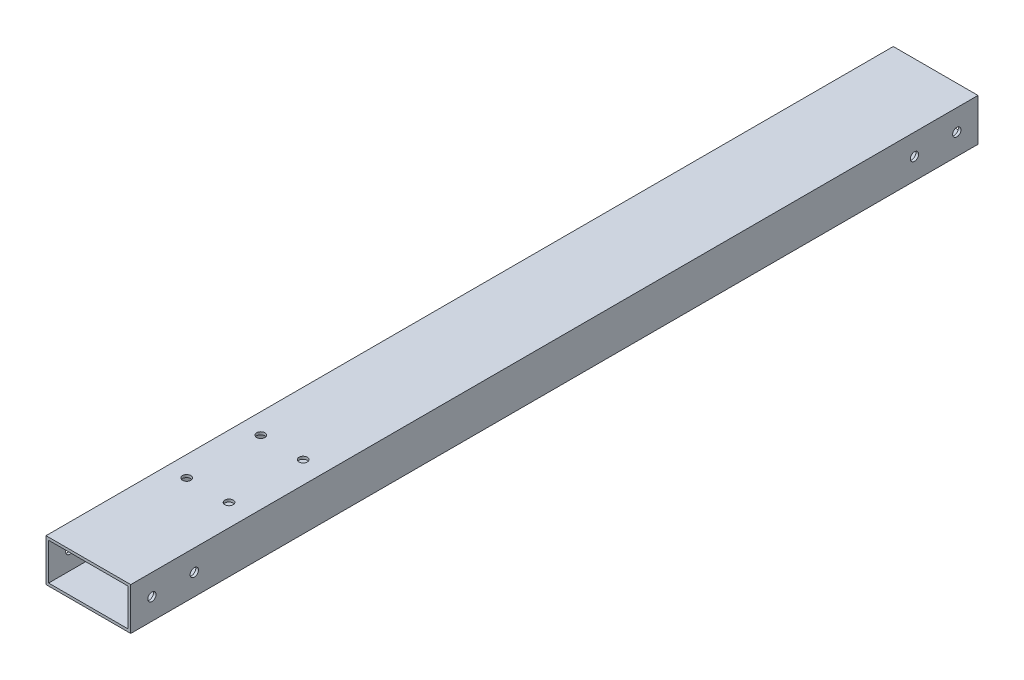
ISO-10303-21;
HEADER;
FILE_DESCRIPTION(('STEP AP214'),'2;1');
FILE_NAME('part.step','',(''),(''),'','','');
FILE_SCHEMA(('AUTOMOTIVE_DESIGN { 1 0 10303 214 1 1 1 1 }'));
ENDSEC;
DATA;
#1=APPLICATION_CONTEXT('core data for automotive mechanical design processes');
#2=APPLICATION_PROTOCOL_DEFINITION('international standard','automotive_design',2000,#1);
#3=PRODUCT_CONTEXT('',#1,'mechanical');
#4=PRODUCT('Part','Part','',(#3));
#5=PRODUCT_RELATED_PRODUCT_CATEGORY('part','',(#4));
#6=PRODUCT_DEFINITION_FORMATION('','',#4);
#7=PRODUCT_DEFINITION_CONTEXT('part definition',#1,'design');
#8=PRODUCT_DEFINITION('design','',#6,#7);
#9=PRODUCT_DEFINITION_SHAPE('','',#8);
#10=(LENGTH_UNIT() NAMED_UNIT(*) SI_UNIT(.MILLI.,.METRE.));
#11=(NAMED_UNIT(*) PLANE_ANGLE_UNIT() SI_UNIT($,.RADIAN.));
#12=(NAMED_UNIT(*) SI_UNIT($,.STERADIAN.) SOLID_ANGLE_UNIT());
#13=UNCERTAINTY_MEASURE_WITH_UNIT(LENGTH_MEASURE(1.E-05),#10,'distance_accuracy_value','');
#14=(GEOMETRIC_REPRESENTATION_CONTEXT(3) GLOBAL_UNCERTAINTY_ASSIGNED_CONTEXT((#13)) GLOBAL_UNIT_ASSIGNED_CONTEXT((#10,
#11,#12)) REPRESENTATION_CONTEXT('',''));
#15=CARTESIAN_POINT('',(0.,0.,0.));
#16=DIRECTION('',(0.,0.,1.));
#17=DIRECTION('',(1.,0.,0.));
#18=AXIS2_PLACEMENT_3D('',#15,#16,#17);
#19=CARTESIAN_POINT('',(25.4,12.7,254.000000508));
#20=DIRECTION('',(0.,-1.,0.));
#21=DIRECTION('',(1.,0.,0.));
#22=AXIS2_PLACEMENT_3D('',#19,#20,#21);
#23=PLANE('',#22);
#24=CARTESIAN_POINT('',(-13.2079999099055,12.7,137.396900507907));
#25=DIRECTION('',(0.,1.,0.));
#26=DIRECTION('',(0.,0.,1.));
#27=AXIS2_PLACEMENT_3D('',#24,#25,#26);
#28=CIRCLE('',#27,2.48919999999999);
#29=CARTESIAN_POINT('',(-13.2079999099055,12.7,139.886100507907));
#30=VERTEX_POINT('',#29);
#31=EDGE_CURVE('E250',#30,#30,#28,.T.);
#32=ORIENTED_EDGE('',*,*,#31,.F.);
#33=EDGE_LOOP('',(#32));
#34=FACE_BOUND('',#33,.T.);
#35=CARTESIAN_POINT('',(-13.2079999099055,12.7,181.846900507907));
#36=DIRECTION('',(0.,1.,0.));
#37=DIRECTION('',(0.,0.,1.));
#38=AXIS2_PLACEMENT_3D('',#35,#36,#37);
#39=CIRCLE('',#38,2.48919999999999);
#40=CARTESIAN_POINT('',(-13.2079999099055,12.7,184.336100507907));
#41=VERTEX_POINT('',#40);
#42=EDGE_CURVE('E247',#41,#41,#39,.T.);
#43=ORIENTED_EDGE('',*,*,#42,.F.);
#44=EDGE_LOOP('',(#43));
#45=FACE_BOUND('',#44,.T.);
#46=CARTESIAN_POINT('',(12.1920000900945,12.7,181.846900507907));
#47=DIRECTION('',(0.,1.,0.));
#48=DIRECTION('',(0.,0.,1.));
#49=AXIS2_PLACEMENT_3D('',#46,#47,#48);
#50=CIRCLE('',#49,2.48919999999999);
#51=CARTESIAN_POINT('',(12.1920000900945,12.7,184.336100507907));
#52=VERTEX_POINT('',#51);
#53=EDGE_CURVE('E269',#52,#52,#50,.T.);
#54=ORIENTED_EDGE('',*,*,#53,.F.);
#55=EDGE_LOOP('',(#54));
#56=FACE_BOUND('',#55,.T.);
#57=DIRECTION('',(0.,0.,-1.));
#58=VECTOR('',#57,1.);
#59=CARTESIAN_POINT('',(25.4,12.7,254.000000508));
#60=LINE('',#59,#58);
#61=CARTESIAN_POINT('',(25.4,12.7,254.000000508));
#62=VERTEX_POINT('',#61);
#63=CARTESIAN_POINT('',(25.4,12.7,-254.000000508));
#64=VERTEX_POINT('',#63);
#65=EDGE_CURVE('E199',#62,#64,#60,.T.);
#66=ORIENTED_EDGE('',*,*,#65,.T.);
#67=DIRECTION('',(-1.,0.,0.));
#68=VECTOR('',#67,1.);
#69=CARTESIAN_POINT('',(25.4,12.7,-254.000000508));
#70=LINE('',#69,#68);
#71=CARTESIAN_POINT('',(-25.4,12.7,-254.000000508));
#72=VERTEX_POINT('',#71);
#73=EDGE_CURVE('E164',#64,#72,#70,.T.);
#74=ORIENTED_EDGE('',*,*,#73,.T.);
#75=DIRECTION('',(0.,0.,-1.));
#76=VECTOR('',#75,1.);
#77=CARTESIAN_POINT('',(-25.4,12.7,254.000000508));
#78=LINE('',#77,#76);
#79=CARTESIAN_POINT('',(-25.4,12.7,254.000000508));
#80=VERTEX_POINT('',#79);
#81=EDGE_CURVE('E196',#80,#72,#78,.T.);
#82=ORIENTED_EDGE('',*,*,#81,.F.);
#83=DIRECTION('',(-1.,0.,0.));
#84=VECTOR('',#83,1.);
#85=CARTESIAN_POINT('',(25.4,12.7,254.000000508));
#86=LINE('',#85,#84);
#87=EDGE_CURVE('E69',#62,#80,#86,.T.);
#88=ORIENTED_EDGE('',*,*,#87,.F.);
#89=EDGE_LOOP('',(#66,#74,#82,#88));
#90=FACE_BOUND('',#89,.T.);
#91=CARTESIAN_POINT('',(12.1920000900945,12.7,137.396900507907));
#92=DIRECTION('',(0.,1.,0.));
#93=DIRECTION('',(0.,0.,1.));
#94=AXIS2_PLACEMENT_3D('',#91,#92,#93);
#95=CIRCLE('',#94,2.48919999999999);
#96=CARTESIAN_POINT('',(12.1920000900945,12.7,139.886100507907));
#97=VERTEX_POINT('',#96);
#98=EDGE_CURVE('E672',#97,#97,#95,.T.);
#99=ORIENTED_EDGE('',*,*,#98,.F.);
#100=EDGE_LOOP('',(#99));
#101=FACE_BOUND('',#100,.T.);
#102=ADVANCED_FACE('F43',(#34,#45,#56,#90,#101),#23,.F.);
#103=CARTESIAN_POINT('',(25.4,-12.7,254.000000508));
#104=DIRECTION('',(-1.,0.,0.));
#105=DIRECTION('',(0.,0.,1.));
#106=AXIS2_PLACEMENT_3D('',#103,#104,#105);
#107=PLANE('',#106);
#108=CARTESIAN_POINT('',(25.4,1.33226762955019E-12,241.300000508));
#109=DIRECTION('',(1.,0.,0.));
#110=DIRECTION('',(0.,0.,-1.));
#111=AXIS2_PLACEMENT_3D('',#108,#109,#110);
#112=CIRCLE('',#111,2.48919999999999);
#113=CARTESIAN_POINT('',(25.4,1.33226762955019E-12,238.810800508));
#114=VERTEX_POINT('',#113);
#115=EDGE_CURVE('E279',#114,#114,#112,.T.);
#116=ORIENTED_EDGE('',*,*,#115,.F.);
#117=EDGE_LOOP('',(#116));
#118=FACE_BOUND('',#117,.T.);
#119=CARTESIAN_POINT('',(25.4,0.,-215.899999492005));
#120=DIRECTION('',(1.,0.,0.));
#121=DIRECTION('',(0.,0.,-1.));
#122=AXIS2_PLACEMENT_3D('',#119,#120,#121);
#123=CIRCLE('',#122,2.48919999999999);
#124=CARTESIAN_POINT('',(25.4,0.,-218.389199492005));
#125=VERTEX_POINT('',#124);
#126=EDGE_CURVE('E299',#125,#125,#123,.T.);
#127=ORIENTED_EDGE('',*,*,#126,.F.);
#128=EDGE_LOOP('',(#127));
#129=FACE_BOUND('',#128,.T.);
#130=CARTESIAN_POINT('',(25.4,0.,-241.299999492005));
#131=DIRECTION('',(1.,0.,0.));
#132=DIRECTION('',(0.,0.,-1.));
#133=AXIS2_PLACEMENT_3D('',#130,#131,#132);
#134=CIRCLE('',#133,2.48919999999999);
#135=CARTESIAN_POINT('',(25.4,0.,-243.789199492005));
#136=VERTEX_POINT('',#135);
#137=EDGE_CURVE('E309',#136,#136,#134,.T.);
#138=ORIENTED_EDGE('',*,*,#137,.F.);
#139=EDGE_LOOP('',(#138));
#140=FACE_BOUND('',#139,.T.);
#141=DIRECTION('',(0.,0.,-1.));
#142=VECTOR('',#141,1.);
#143=CARTESIAN_POINT('',(25.4,-12.7,254.000000508));
#144=LINE('',#143,#142);
#145=CARTESIAN_POINT('',(25.4,-12.7,254.000000508));
#146=VERTEX_POINT('',#145);
#147=CARTESIAN_POINT('',(25.4,-12.7,-254.000000508));
#148=VERTEX_POINT('',#147);
#149=EDGE_CURVE('E53',#146,#148,#144,.T.);
#150=ORIENTED_EDGE('',*,*,#149,.T.);
#151=DIRECTION('',(0.,1.,0.));
#152=VECTOR('',#151,1.);
#153=CARTESIAN_POINT('',(25.4,-12.7,-254.000000508));
#154=LINE('',#153,#152);
#155=EDGE_CURVE('E160',#148,#64,#154,.T.);
#156=ORIENTED_EDGE('',*,*,#155,.T.);
#157=ORIENTED_EDGE('',*,*,#65,.F.);
#158=DIRECTION('',(0.,1.,0.));
#159=VECTOR('',#158,1.);
#160=CARTESIAN_POINT('',(25.4,-12.7,254.000000508));
#161=LINE('',#160,#159);
#162=EDGE_CURVE('E191',#146,#62,#161,.T.);
#163=ORIENTED_EDGE('',*,*,#162,.F.);
#164=EDGE_LOOP('',(#150,#156,#157,#163));
#165=FACE_BOUND('',#164,.T.);
#166=CARTESIAN_POINT('',(25.4,1.33226762955019E-12,215.900000508));
#167=DIRECTION('',(1.,0.,0.));
#168=DIRECTION('',(0.,0.,-1.));
#169=AXIS2_PLACEMENT_3D('',#166,#167,#168);
#170=CIRCLE('',#169,2.48919999999999);
#171=CARTESIAN_POINT('',(25.4,1.33226762955019E-12,213.410800508));
#172=VERTEX_POINT('',#171);
#173=EDGE_CURVE('E289',#172,#172,#170,.T.);
#174=ORIENTED_EDGE('',*,*,#173,.F.);
#175=EDGE_LOOP('',(#174));
#176=FACE_BOUND('',#175,.T.);
#177=ADVANCED_FACE('F334',(#118,#129,#140,#165,#176),#107,.F.);
#178=CARTESIAN_POINT('',(0.,0.,254.000000508));
#179=DIRECTION('',(0.,0.,1.));
#180=DIRECTION('',(1.,0.,0.));
#181=AXIS2_PLACEMENT_3D('',#178,#179,#180);
#182=PLANE('',#181);
#183=DIRECTION('',(0.,-1.,0.));
#184=VECTOR('',#183,1.);
#185=CARTESIAN_POINT('',(-25.4,12.7,254.000000508));
#186=LINE('',#185,#184);
#187=CARTESIAN_POINT('',(-25.4,-12.7,254.000000508));
#188=VERTEX_POINT('',#187);
#189=EDGE_CURVE('E123',#80,#188,#186,.T.);
#190=ORIENTED_EDGE('',*,*,#189,.T.);
#191=DIRECTION('',(1.,0.,0.));
#192=VECTOR('',#191,1.);
#193=CARTESIAN_POINT('',(-25.4,-12.7,254.000000508));
#194=LINE('',#193,#192);
#195=EDGE_CURVE('E188',#188,#146,#194,.T.);
#196=ORIENTED_EDGE('',*,*,#195,.T.);
#197=ORIENTED_EDGE('',*,*,#162,.T.);
#198=ORIENTED_EDGE('',*,*,#87,.T.);
#199=EDGE_LOOP('',(#190,#196,#197,#198));
#200=FACE_BOUND('',#199,.T.);
#201=DIRECTION('',(1.,0.,0.));
#202=VECTOR('',#201,1.);
#203=CARTESIAN_POINT('',(-23.8125,-11.1125,254.000000508));
#204=LINE('',#203,#202);
#205=CARTESIAN_POINT('',(-23.8125,-11.1125,254.000000508));
#206=VERTEX_POINT('',#205);
#207=CARTESIAN_POINT('',(23.8125,-11.1125,254.000000508));
#208=VERTEX_POINT('',#207);
#209=EDGE_CURVE('E170',#206,#208,#204,.T.);
#210=ORIENTED_EDGE('',*,*,#209,.F.);
#211=DIRECTION('',(0.,-1.,0.));
#212=VECTOR('',#211,1.);
#213=CARTESIAN_POINT('',(-23.8125,11.1125,254.000000508));
#214=LINE('',#213,#212);
#215=CARTESIAN_POINT('',(-23.8125,11.1125,254.000000508));
#216=VERTEX_POINT('',#215);
#217=EDGE_CURVE('E119',#216,#206,#214,.T.);
#218=ORIENTED_EDGE('',*,*,#217,.F.);
#219=DIRECTION('',(-1.,0.,0.));
#220=VECTOR('',#219,1.);
#221=CARTESIAN_POINT('',(23.8125,11.1125,254.000000508));
#222=LINE('',#221,#220);
#223=CARTESIAN_POINT('',(23.8125,11.1125,254.000000508));
#224=VERTEX_POINT('',#223);
#225=EDGE_CURVE('E176',#224,#216,#222,.T.);
#226=ORIENTED_EDGE('',*,*,#225,.F.);
#227=DIRECTION('',(0.,1.,0.));
#228=VECTOR('',#227,1.);
#229=CARTESIAN_POINT('',(23.8125,-11.1125,254.000000508));
#230=LINE('',#229,#228);
#231=EDGE_CURVE('E173',#208,#224,#230,.T.);
#232=ORIENTED_EDGE('',*,*,#231,.F.);
#233=EDGE_LOOP('',(#210,#218,#226,#232));
#234=FACE_BOUND('',#233,.T.);
#235=ADVANCED_FACE('F342',(#200,#234),#182,.T.);
#236=CARTESIAN_POINT('',(-25.4,12.7,254.000000508));
#237=DIRECTION('',(1.,0.,0.));
#238=DIRECTION('',(0.,0.,-1.));
#239=AXIS2_PLACEMENT_3D('',#236,#237,#238);
#240=PLANE('',#239);
#241=CARTESIAN_POINT('',(-25.4,1.33226762955019E-12,241.300000508));
#242=DIRECTION('',(1.,0.,0.));
#243=DIRECTION('',(0.,0.,-1.));
#244=AXIS2_PLACEMENT_3D('',#241,#242,#243);
#245=CIRCLE('',#244,2.48919999999999);
#246=CARTESIAN_POINT('',(-25.4,1.33226762955019E-12,238.810800508));
#247=VERTEX_POINT('',#246);
#248=EDGE_CURVE('E225',#247,#247,#245,.T.);
#249=ORIENTED_EDGE('',*,*,#248,.T.);
#250=EDGE_LOOP('',(#249));
#251=FACE_BOUND('',#250,.T.);
#252=CARTESIAN_POINT('',(-25.4,1.33226762955019E-12,215.900000508));
#253=DIRECTION('',(1.,0.,0.));
#254=DIRECTION('',(0.,0.,-1.));
#255=AXIS2_PLACEMENT_3D('',#252,#253,#254);
#256=CIRCLE('',#255,2.48919999999999);
#257=CARTESIAN_POINT('',(-25.4,1.33226762955019E-12,213.410800508));
#258=VERTEX_POINT('',#257);
#259=EDGE_CURVE('E219',#258,#258,#256,.T.);
#260=ORIENTED_EDGE('',*,*,#259,.T.);
#261=EDGE_LOOP('',(#260));
#262=FACE_BOUND('',#261,.T.);
#263=CARTESIAN_POINT('',(-25.4,0.,-215.899999492005));
#264=DIRECTION('',(1.,0.,0.));
#265=DIRECTION('',(0.,0.,-1.));
#266=AXIS2_PLACEMENT_3D('',#263,#264,#265);
#267=CIRCLE('',#266,2.48919999999999);
#268=CARTESIAN_POINT('',(-25.4,0.,-218.389199492005));
#269=VERTEX_POINT('',#268);
#270=EDGE_CURVE('E213',#269,#269,#267,.T.);
#271=ORIENTED_EDGE('',*,*,#270,.T.);
#272=EDGE_LOOP('',(#271));
#273=FACE_BOUND('',#272,.T.);
#274=CARTESIAN_POINT('',(-25.4,0.,-241.299999492005));
#275=DIRECTION('',(1.,0.,0.));
#276=DIRECTION('',(0.,0.,-1.));
#277=AXIS2_PLACEMENT_3D('',#274,#275,#276);
#278=CIRCLE('',#277,2.48919999999999);
#279=CARTESIAN_POINT('',(-25.4,0.,-243.789199492005));
#280=VERTEX_POINT('',#279);
#281=EDGE_CURVE('E207',#280,#280,#278,.T.);
#282=ORIENTED_EDGE('',*,*,#281,.T.);
#283=EDGE_LOOP('',(#282));
#284=FACE_BOUND('',#283,.T.);
#285=ORIENTED_EDGE('',*,*,#81,.T.);
#286=DIRECTION('',(0.,-1.,0.));
#287=VECTOR('',#286,1.);
#288=CARTESIAN_POINT('',(-25.4,12.7,-254.000000508));
#289=LINE('',#288,#287);
#290=CARTESIAN_POINT('',(-25.4,-12.7,-254.000000508));
#291=VERTEX_POINT('',#290);
#292=EDGE_CURVE('E152',#72,#291,#289,.T.);
#293=ORIENTED_EDGE('',*,*,#292,.T.);
#294=DIRECTION('',(0.,0.,-1.));
#295=VECTOR('',#294,1.);
#296=CARTESIAN_POINT('',(-25.4,-12.7,254.000000508));
#297=LINE('',#296,#295);
#298=EDGE_CURVE('E11',#188,#291,#297,.T.);
#299=ORIENTED_EDGE('',*,*,#298,.F.);
#300=ORIENTED_EDGE('',*,*,#189,.F.);
#301=EDGE_LOOP('',(#285,#293,#299,#300));
#302=FACE_BOUND('',#301,.T.);
#303=ADVANCED_FACE('F45',(#251,#262,#273,#284,#302),#240,.F.);
#304=CARTESIAN_POINT('',(-25.4,-12.7,254.000000508));
#305=DIRECTION('',(0.,1.,0.));
#306=DIRECTION('',(-1.,0.,0.));
#307=AXIS2_PLACEMENT_3D('',#304,#305,#306);
#308=PLANE('',#307);
#309=CARTESIAN_POINT('',(12.1920000900945,-12.7,137.396900507907));
#310=DIRECTION('',(0.,1.,0.));
#311=DIRECTION('',(0.,0.,1.));
#312=AXIS2_PLACEMENT_3D('',#309,#310,#311);
#313=CIRCLE('',#312,2.48919999999999);
#314=CARTESIAN_POINT('',(12.1920000900945,-12.7,139.886100507907));
#315=VERTEX_POINT('',#314);
#316=EDGE_CURVE('E360',#315,#315,#313,.T.);
#317=ORIENTED_EDGE('',*,*,#316,.T.);
#318=EDGE_LOOP('',(#317));
#319=FACE_BOUND('',#318,.T.);
#320=CARTESIAN_POINT('',(-13.2079999099055,-12.7,137.396900507907));
#321=DIRECTION('',(0.,1.,0.));
#322=DIRECTION('',(0.,0.,1.));
#323=AXIS2_PLACEMENT_3D('',#320,#321,#322);
#324=CIRCLE('',#323,2.48919999999999);
#325=CARTESIAN_POINT('',(-13.2079999099055,-12.7,139.886100507907));
#326=VERTEX_POINT('',#325);
#327=EDGE_CURVE('E241',#326,#326,#324,.T.);
#328=ORIENTED_EDGE('',*,*,#327,.T.);
#329=EDGE_LOOP('',(#328));
#330=FACE_BOUND('',#329,.T.);
#331=CARTESIAN_POINT('',(-13.2079999099055,-12.7,181.846900507907));
#332=DIRECTION('',(0.,1.,0.));
#333=DIRECTION('',(0.,0.,1.));
#334=AXIS2_PLACEMENT_3D('',#331,#332,#333);
#335=CIRCLE('',#334,2.48919999999999);
#336=CARTESIAN_POINT('',(-13.2079999099055,-12.7,184.336100507907));
#337=VERTEX_POINT('',#336);
#338=EDGE_CURVE('E236',#337,#337,#335,.T.);
#339=ORIENTED_EDGE('',*,*,#338,.T.);
#340=EDGE_LOOP('',(#339));
#341=FACE_BOUND('',#340,.T.);
#342=CARTESIAN_POINT('',(12.1920000900945,-12.7,181.846900507907));
#343=DIRECTION('',(0.,1.,0.));
#344=DIRECTION('',(0.,0.,1.));
#345=AXIS2_PLACEMENT_3D('',#342,#343,#344);
#346=CIRCLE('',#345,2.48919999999999);
#347=CARTESIAN_POINT('',(12.1920000900945,-12.7,184.336100507907));
#348=VERTEX_POINT('',#347);
#349=EDGE_CURVE('E231',#348,#348,#346,.T.);
#350=ORIENTED_EDGE('',*,*,#349,.T.);
#351=EDGE_LOOP('',(#350));
#352=FACE_BOUND('',#351,.T.);
#353=ORIENTED_EDGE('',*,*,#298,.T.);
#354=DIRECTION('',(1.,0.,0.));
#355=VECTOR('',#354,1.);
#356=CARTESIAN_POINT('',(-25.4,-12.7,-254.000000508));
#357=LINE('',#356,#355);
#358=EDGE_CURVE('E156',#291,#148,#357,.T.);
#359=ORIENTED_EDGE('',*,*,#358,.T.);
#360=ORIENTED_EDGE('',*,*,#149,.F.);
#361=ORIENTED_EDGE('',*,*,#195,.F.);
#362=EDGE_LOOP('',(#353,#359,#360,#361));
#363=FACE_BOUND('',#362,.T.);
#364=ADVANCED_FACE('F349',(#319,#330,#341,#352,#363),#308,.F.);
#365=CARTESIAN_POINT('',(-23.8125,11.1125,254.000000508));
#366=DIRECTION('',(1.,0.,0.));
#367=DIRECTION('',(0.,1.,0.));
#368=AXIS2_PLACEMENT_3D('',#365,#366,#367);
#369=PLANE('',#368);
#370=CARTESIAN_POINT('',(-23.8125,1.33226762955019E-12,241.300000508));
#371=DIRECTION('',(1.,0.,0.));
#372=DIRECTION('',(0.,1.,0.));
#373=AXIS2_PLACEMENT_3D('',#370,#371,#372);
#374=CIRCLE('',#373,2.48919999999999);
#375=CARTESIAN_POINT('',(-23.8125,2.48920000000132,241.300000508));
#376=VERTEX_POINT('',#375);
#377=EDGE_CURVE('E224',#376,#376,#374,.T.);
#378=ORIENTED_EDGE('',*,*,#377,.F.);
#379=EDGE_LOOP('',(#378));
#380=FACE_BOUND('',#379,.T.);
#381=CARTESIAN_POINT('',(-23.8125,1.33226762955019E-12,215.900000508));
#382=DIRECTION('',(1.,0.,0.));
#383=DIRECTION('',(0.,1.,0.));
#384=AXIS2_PLACEMENT_3D('',#381,#382,#383);
#385=CIRCLE('',#384,2.48919999999999);
#386=CARTESIAN_POINT('',(-23.8125,2.48920000000132,215.900000508));
#387=VERTEX_POINT('',#386);
#388=EDGE_CURVE('E218',#387,#387,#385,.T.);
#389=ORIENTED_EDGE('',*,*,#388,.F.);
#390=EDGE_LOOP('',(#389));
#391=FACE_BOUND('',#390,.T.);
#392=CARTESIAN_POINT('',(-23.8125,0.,-215.899999492005));
#393=DIRECTION('',(1.,0.,0.));
#394=DIRECTION('',(0.,1.,0.));
#395=AXIS2_PLACEMENT_3D('',#392,#393,#394);
#396=CIRCLE('',#395,2.48919999999999);
#397=CARTESIAN_POINT('',(-23.8125,2.48919999999999,-215.899999492005));
#398=VERTEX_POINT('',#397);
#399=EDGE_CURVE('E212',#398,#398,#396,.T.);
#400=ORIENTED_EDGE('',*,*,#399,.F.);
#401=EDGE_LOOP('',(#400));
#402=FACE_BOUND('',#401,.T.);
#403=CARTESIAN_POINT('',(-23.8125,0.,-241.299999492005));
#404=DIRECTION('',(1.,0.,0.));
#405=DIRECTION('',(0.,1.,0.));
#406=AXIS2_PLACEMENT_3D('',#403,#404,#405);
#407=CIRCLE('',#406,2.48919999999999);
#408=CARTESIAN_POINT('',(-23.8125,2.48919999999999,-241.299999492005));
#409=VERTEX_POINT('',#408);
#410=EDGE_CURVE('E140',#409,#409,#407,.T.);
#411=ORIENTED_EDGE('',*,*,#410,.F.);
#412=EDGE_LOOP('',(#411));
#413=FACE_BOUND('',#412,.T.);
#414=DIRECTION('',(0.,0.,-1.));
#415=VECTOR('',#414,1.);
#416=CARTESIAN_POINT('',(-23.8125,-11.1125,254.000000508));
#417=LINE('',#416,#415);
#418=CARTESIAN_POINT('',(-23.8125,-11.1125,-254.000000508));
#419=VERTEX_POINT('',#418);
#420=EDGE_CURVE('E111',#206,#419,#417,.T.);
#421=ORIENTED_EDGE('',*,*,#420,.T.);
#422=DIRECTION('',(0.,-1.,0.));
#423=VECTOR('',#422,1.);
#424=CARTESIAN_POINT('',(-23.8125,11.1125,-254.000000508));
#425=LINE('',#424,#423);
#426=CARTESIAN_POINT('',(-23.8125,11.1125,-254.000000508));
#427=VERTEX_POINT('',#426);
#428=EDGE_CURVE('E116',#427,#419,#425,.T.);
#429=ORIENTED_EDGE('',*,*,#428,.F.);
#430=DIRECTION('',(0.,0.,-1.));
#431=VECTOR('',#430,1.);
#432=CARTESIAN_POINT('',(-23.8125,11.1125,254.000000508));
#433=LINE('',#432,#431);
#434=EDGE_CURVE('E179',#216,#427,#433,.T.);
#435=ORIENTED_EDGE('',*,*,#434,.F.);
#436=ORIENTED_EDGE('',*,*,#217,.T.);
#437=EDGE_LOOP('',(#421,#429,#435,#436));
#438=FACE_BOUND('',#437,.T.);
#439=ADVANCED_FACE('F113',(#380,#391,#402,#413,#438),#369,.T.);
#440=CARTESIAN_POINT('',(-23.8125,-11.1125,254.000000508));
#441=DIRECTION('',(0.,1.,0.));
#442=DIRECTION('',(0.,0.,1.));
#443=AXIS2_PLACEMENT_3D('',#440,#441,#442);
#444=PLANE('',#443);
#445=CARTESIAN_POINT('',(12.1920000900945,-11.1125,137.396900507907));
#446=DIRECTION('',(0.,1.,0.));
#447=DIRECTION('',(0.,0.,1.));
#448=AXIS2_PLACEMENT_3D('',#445,#446,#447);
#449=CIRCLE('',#448,2.48919999999999);
#450=CARTESIAN_POINT('',(12.1920000900945,-11.1125,139.886100507907));
#451=VERTEX_POINT('',#450);
#452=EDGE_CURVE('E256',#451,#451,#449,.T.);
#453=ORIENTED_EDGE('',*,*,#452,.F.);
#454=EDGE_LOOP('',(#453));
#455=FACE_BOUND('',#454,.T.);
#456=CARTESIAN_POINT('',(-13.2079999099055,-11.1125,137.396900507907));
#457=DIRECTION('',(0.,1.,0.));
#458=DIRECTION('',(0.,0.,1.));
#459=AXIS2_PLACEMENT_3D('',#456,#457,#458);
#460=CIRCLE('',#459,2.48919999999999);
#461=CARTESIAN_POINT('',(-13.2079999099055,-11.1125,139.886100507907));
#462=VERTEX_POINT('',#461);
#463=EDGE_CURVE('E237',#462,#462,#460,.T.);
#464=ORIENTED_EDGE('',*,*,#463,.F.);
#465=EDGE_LOOP('',(#464));
#466=FACE_BOUND('',#465,.T.);
#467=CARTESIAN_POINT('',(-13.2079999099055,-11.1125,181.846900507907));
#468=DIRECTION('',(0.,1.,0.));
#469=DIRECTION('',(0.,0.,1.));
#470=AXIS2_PLACEMENT_3D('',#467,#468,#469);
#471=CIRCLE('',#470,2.48919999999999);
#472=CARTESIAN_POINT('',(-13.2079999099055,-11.1125,184.336100507907));
#473=VERTEX_POINT('',#472);
#474=EDGE_CURVE('E232',#473,#473,#471,.T.);
#475=ORIENTED_EDGE('',*,*,#474,.F.);
#476=EDGE_LOOP('',(#475));
#477=FACE_BOUND('',#476,.T.);
#478=CARTESIAN_POINT('',(12.1920000900945,-11.1125,181.846900507907));
#479=DIRECTION('',(0.,1.,0.));
#480=DIRECTION('',(0.,0.,1.));
#481=AXIS2_PLACEMENT_3D('',#478,#479,#480);
#482=CIRCLE('',#481,2.48919999999999);
#483=CARTESIAN_POINT('',(12.1920000900945,-11.1125,184.336100507907));
#484=VERTEX_POINT('',#483);
#485=EDGE_CURVE('E230',#484,#484,#482,.T.);
#486=ORIENTED_EDGE('',*,*,#485,.F.);
#487=EDGE_LOOP('',(#486));
#488=FACE_BOUND('',#487,.T.);
#489=DIRECTION('',(0.,0.,-1.));
#490=VECTOR('',#489,1.);
#491=CARTESIAN_POINT('',(23.8125,-11.1125,254.000000508));
#492=LINE('',#491,#490);
#493=CARTESIAN_POINT('',(23.8125,-11.1125,-254.000000508));
#494=VERTEX_POINT('',#493);
#495=EDGE_CURVE('E124',#208,#494,#492,.T.);
#496=ORIENTED_EDGE('',*,*,#495,.T.);
#497=DIRECTION('',(1.,0.,0.));
#498=VECTOR('',#497,1.);
#499=CARTESIAN_POINT('',(-23.8125,-11.1125,-254.000000508));
#500=LINE('',#499,#498);
#501=EDGE_CURVE('E127',#419,#494,#500,.T.);
#502=ORIENTED_EDGE('',*,*,#501,.F.);
#503=ORIENTED_EDGE('',*,*,#420,.F.);
#504=ORIENTED_EDGE('',*,*,#209,.T.);
#505=EDGE_LOOP('',(#496,#502,#503,#504));
#506=FACE_BOUND('',#505,.T.);
#507=ADVANCED_FACE('F128',(#455,#466,#477,#488,#506),#444,.T.);
#508=CARTESIAN_POINT('',(23.8125,-11.1125,254.000000508));
#509=DIRECTION('',(-1.,0.,0.));
#510=DIRECTION('',(0.,0.,1.));
#511=AXIS2_PLACEMENT_3D('',#508,#509,#510);
#512=PLANE('',#511);
#513=CARTESIAN_POINT('',(23.8125,1.33226762955019E-12,241.300000508));
#514=DIRECTION('',(-1.,0.,0.));
#515=DIRECTION('',(0.,0.,1.));
#516=AXIS2_PLACEMENT_3D('',#513,#514,#515);
#517=CIRCLE('',#516,2.48919999999999);
#518=CARTESIAN_POINT('',(23.8125,1.33226762955019E-12,243.789200508));
#519=VERTEX_POINT('',#518);
#520=EDGE_CURVE('E220',#519,#519,#517,.T.);
#521=ORIENTED_EDGE('',*,*,#520,.F.);
#522=EDGE_LOOP('',(#521));
#523=FACE_BOUND('',#522,.T.);
#524=CARTESIAN_POINT('',(23.8125,1.33226762955019E-12,215.900000508));
#525=DIRECTION('',(-1.,0.,0.));
#526=DIRECTION('',(0.,0.,1.));
#527=AXIS2_PLACEMENT_3D('',#524,#525,#526);
#528=CIRCLE('',#527,2.48919999999999);
#529=CARTESIAN_POINT('',(23.8125,1.33226762955019E-12,218.389200508));
#530=VERTEX_POINT('',#529);
#531=EDGE_CURVE('E214',#530,#530,#528,.T.);
#532=ORIENTED_EDGE('',*,*,#531,.F.);
#533=EDGE_LOOP('',(#532));
#534=FACE_BOUND('',#533,.T.);
#535=CARTESIAN_POINT('',(23.8125,0.,-215.899999492005));
#536=DIRECTION('',(-1.,0.,0.));
#537=DIRECTION('',(0.,0.,1.));
#538=AXIS2_PLACEMENT_3D('',#535,#536,#537);
#539=CIRCLE('',#538,2.48919999999999);
#540=CARTESIAN_POINT('',(23.8125,0.,-213.410799492005));
#541=VERTEX_POINT('',#540);
#542=EDGE_CURVE('E208',#541,#541,#539,.T.);
#543=ORIENTED_EDGE('',*,*,#542,.F.);
#544=EDGE_LOOP('',(#543));
#545=FACE_BOUND('',#544,.T.);
#546=CARTESIAN_POINT('',(23.8125,0.,-241.299999492005));
#547=DIRECTION('',(-1.,0.,0.));
#548=DIRECTION('',(0.,0.,1.));
#549=AXIS2_PLACEMENT_3D('',#546,#547,#548);
#550=CIRCLE('',#549,2.48919999999999);
#551=CARTESIAN_POINT('',(23.8125,0.,-238.810799492005));
#552=VERTEX_POINT('',#551);
#553=EDGE_CURVE('E144',#552,#552,#550,.T.);
#554=ORIENTED_EDGE('',*,*,#553,.F.);
#555=EDGE_LOOP('',(#554));
#556=FACE_BOUND('',#555,.T.);
#557=DIRECTION('',(0.,0.,-1.));
#558=VECTOR('',#557,1.);
#559=CARTESIAN_POINT('',(23.8125,11.1125,254.000000508));
#560=LINE('',#559,#558);
#561=CARTESIAN_POINT('',(23.8125,11.1125,-254.000000508));
#562=VERTEX_POINT('',#561);
#563=EDGE_CURVE('E61',#224,#562,#560,.T.);
#564=ORIENTED_EDGE('',*,*,#563,.T.);
#565=DIRECTION('',(0.,1.,0.));
#566=VECTOR('',#565,1.);
#567=CARTESIAN_POINT('',(23.8125,-11.1125,-254.000000508));
#568=LINE('',#567,#566);
#569=EDGE_CURVE('E134',#494,#562,#568,.T.);
#570=ORIENTED_EDGE('',*,*,#569,.F.);
#571=ORIENTED_EDGE('',*,*,#495,.F.);
#572=ORIENTED_EDGE('',*,*,#231,.T.);
#573=EDGE_LOOP('',(#564,#570,#571,#572));
#574=FACE_BOUND('',#573,.T.);
#575=ADVANCED_FACE('F384',(#523,#534,#545,#556,#574),#512,.T.);
#576=CARTESIAN_POINT('',(23.8125,11.1125,254.000000508));
#577=DIRECTION('',(0.,-1.,0.));
#578=DIRECTION('',(0.,0.,-1.));
#579=AXIS2_PLACEMENT_3D('',#576,#577,#578);
#580=PLANE('',#579);
#581=CARTESIAN_POINT('',(12.1920000900945,11.1125,137.396900507907));
#582=DIRECTION('',(0.,-1.,0.));
#583=DIRECTION('',(0.,0.,-1.));
#584=AXIS2_PLACEMENT_3D('',#581,#582,#583);
#585=CIRCLE('',#584,2.48919999999999);
#586=CARTESIAN_POINT('',(12.1920000900945,11.1125,134.907700507907));
#587=VERTEX_POINT('',#586);
#588=EDGE_CURVE('E47',#587,#587,#585,.T.);
#589=ORIENTED_EDGE('',*,*,#588,.F.);
#590=EDGE_LOOP('',(#589));
#591=FACE_BOUND('',#590,.T.);
#592=CARTESIAN_POINT('',(-13.2079999099055,11.1125,137.396900507907));
#593=DIRECTION('',(0.,-1.,0.));
#594=DIRECTION('',(0.,0.,-1.));
#595=AXIS2_PLACEMENT_3D('',#592,#593,#594);
#596=CIRCLE('',#595,2.48919999999999);
#597=CARTESIAN_POINT('',(-13.2079999099055,11.1125,134.907700507907));
#598=VERTEX_POINT('',#597);
#599=EDGE_CURVE('E240',#598,#598,#596,.T.);
#600=ORIENTED_EDGE('',*,*,#599,.F.);
#601=EDGE_LOOP('',(#600));
#602=FACE_BOUND('',#601,.T.);
#603=CARTESIAN_POINT('',(-13.2079999099055,11.1125,181.846900507907));
#604=DIRECTION('',(0.,-1.,0.));
#605=DIRECTION('',(0.,0.,-1.));
#606=AXIS2_PLACEMENT_3D('',#603,#604,#605);
#607=CIRCLE('',#606,2.48919999999999);
#608=CARTESIAN_POINT('',(-13.2079999099055,11.1125,179.357700507907));
#609=VERTEX_POINT('',#608);
#610=EDGE_CURVE('E235',#609,#609,#607,.T.);
#611=ORIENTED_EDGE('',*,*,#610,.F.);
#612=EDGE_LOOP('',(#611));
#613=FACE_BOUND('',#612,.T.);
#614=CARTESIAN_POINT('',(12.1920000900945,11.1125,181.846900507907));
#615=DIRECTION('',(0.,-1.,0.));
#616=DIRECTION('',(0.,0.,-1.));
#617=AXIS2_PLACEMENT_3D('',#614,#615,#616);
#618=CIRCLE('',#617,2.48919999999999);
#619=CARTESIAN_POINT('',(12.1920000900945,11.1125,179.357700507907));
#620=VERTEX_POINT('',#619);
#621=EDGE_CURVE('E226',#620,#620,#618,.T.);
#622=ORIENTED_EDGE('',*,*,#621,.F.);
#623=EDGE_LOOP('',(#622));
#624=FACE_BOUND('',#623,.T.);
#625=ORIENTED_EDGE('',*,*,#434,.T.);
#626=DIRECTION('',(-1.,0.,0.));
#627=VECTOR('',#626,1.);
#628=CARTESIAN_POINT('',(23.8125,11.1125,-254.000000508));
#629=LINE('',#628,#627);
#630=EDGE_CURVE('E138',#562,#427,#629,.T.);
#631=ORIENTED_EDGE('',*,*,#630,.F.);
#632=ORIENTED_EDGE('',*,*,#563,.F.);
#633=ORIENTED_EDGE('',*,*,#225,.T.);
#634=EDGE_LOOP('',(#625,#631,#632,#633));
#635=FACE_BOUND('',#634,.T.);
#636=ADVANCED_FACE('F385',(#591,#602,#613,#624,#635),#580,.T.);
#637=CARTESIAN_POINT('',(0.,0.,-254.000000508));
#638=DIRECTION('',(0.,0.,1.));
#639=DIRECTION('',(1.,0.,0.));
#640=AXIS2_PLACEMENT_3D('',#637,#638,#639);
#641=PLANE('',#640);
#642=ORIENTED_EDGE('',*,*,#630,.T.);
#643=ORIENTED_EDGE('',*,*,#428,.T.);
#644=ORIENTED_EDGE('',*,*,#501,.T.);
#645=ORIENTED_EDGE('',*,*,#569,.T.);
#646=EDGE_LOOP('',(#642,#643,#644,#645));
#647=FACE_BOUND('',#646,.T.);
#648=ORIENTED_EDGE('',*,*,#292,.F.);
#649=ORIENTED_EDGE('',*,*,#73,.F.);
#650=ORIENTED_EDGE('',*,*,#155,.F.);
#651=ORIENTED_EDGE('',*,*,#358,.F.);
#652=EDGE_LOOP('',(#648,#649,#650,#651));
#653=FACE_BOUND('',#652,.T.);
#654=ADVANCED_FACE('F136',(#647,#653),#641,.F.);
#655=CARTESIAN_POINT('',(25.4,0.,-241.299999492005));
#656=DIRECTION('',(1.,0.,0.));
#657=DIRECTION('',(0.,0.,-1.));
#658=AXIS2_PLACEMENT_3D('',#655,#656,#657);
#659=CYLINDRICAL_SURFACE('',#658,2.48919999999999);
#660=ORIENTED_EDGE('',*,*,#553,.T.);
#661=EDGE_LOOP('',(#660));
#662=FACE_BOUND('',#661,.T.);
#663=ORIENTED_EDGE('',*,*,#137,.T.);
#664=EDGE_LOOP('',(#663));
#665=FACE_BOUND('',#664,.T.);
#666=ADVANCED_FACE('F321',(#662,#665),#659,.F.);
#667=ORIENTED_EDGE('',*,*,#410,.T.);
#668=EDGE_LOOP('',(#667));
#669=FACE_BOUND('',#668,.T.);
#670=ORIENTED_EDGE('',*,*,#281,.F.);
#671=EDGE_LOOP('',(#670));
#672=FACE_BOUND('',#671,.T.);
#673=ADVANCED_FACE('F318',(#669,#672),#659,.F.);
#674=CARTESIAN_POINT('',(25.4,0.,-215.899999492005));
#675=DIRECTION('',(1.,0.,0.));
#676=DIRECTION('',(0.,0.,-1.));
#677=AXIS2_PLACEMENT_3D('',#674,#675,#676);
#678=CYLINDRICAL_SURFACE('',#677,2.48919999999999);
#679=ORIENTED_EDGE('',*,*,#542,.T.);
#680=EDGE_LOOP('',(#679));
#681=FACE_BOUND('',#680,.T.);
#682=ORIENTED_EDGE('',*,*,#126,.T.);
#683=EDGE_LOOP('',(#682));
#684=FACE_BOUND('',#683,.T.);
#685=ADVANCED_FACE('F320',(#681,#684),#678,.F.);
#686=ORIENTED_EDGE('',*,*,#399,.T.);
#687=EDGE_LOOP('',(#686));
#688=FACE_BOUND('',#687,.T.);
#689=ORIENTED_EDGE('',*,*,#270,.F.);
#690=EDGE_LOOP('',(#689));
#691=FACE_BOUND('',#690,.T.);
#692=ADVANCED_FACE('F328',(#688,#691),#678,.F.);
#693=CARTESIAN_POINT('',(25.4,1.33226762955019E-12,215.900000508));
#694=DIRECTION('',(1.,0.,0.));
#695=DIRECTION('',(0.,0.,-1.));
#696=AXIS2_PLACEMENT_3D('',#693,#694,#695);
#697=CYLINDRICAL_SURFACE('',#696,2.48919999999999);
#698=ORIENTED_EDGE('',*,*,#531,.T.);
#699=EDGE_LOOP('',(#698));
#700=FACE_BOUND('',#699,.T.);
#701=ORIENTED_EDGE('',*,*,#173,.T.);
#702=EDGE_LOOP('',(#701));
#703=FACE_BOUND('',#702,.T.);
#704=ADVANCED_FACE('F432',(#700,#703),#697,.F.);
#705=ORIENTED_EDGE('',*,*,#388,.T.);
#706=EDGE_LOOP('',(#705));
#707=FACE_BOUND('',#706,.T.);
#708=ORIENTED_EDGE('',*,*,#259,.F.);
#709=EDGE_LOOP('',(#708));
#710=FACE_BOUND('',#709,.T.);
#711=ADVANCED_FACE('F430',(#707,#710),#697,.F.);
#712=CARTESIAN_POINT('',(25.4,1.33226762955019E-12,241.300000508));
#713=DIRECTION('',(1.,0.,0.));
#714=DIRECTION('',(0.,0.,-1.));
#715=AXIS2_PLACEMENT_3D('',#712,#713,#714);
#716=CYLINDRICAL_SURFACE('',#715,2.48919999999999);
#717=ORIENTED_EDGE('',*,*,#520,.T.);
#718=EDGE_LOOP('',(#717));
#719=FACE_BOUND('',#718,.T.);
#720=ORIENTED_EDGE('',*,*,#115,.T.);
#721=EDGE_LOOP('',(#720));
#722=FACE_BOUND('',#721,.T.);
#723=ADVANCED_FACE('F427',(#719,#722),#716,.F.);
#724=ORIENTED_EDGE('',*,*,#377,.T.);
#725=EDGE_LOOP('',(#724));
#726=FACE_BOUND('',#725,.T.);
#727=ORIENTED_EDGE('',*,*,#248,.F.);
#728=EDGE_LOOP('',(#727));
#729=FACE_BOUND('',#728,.T.);
#730=ADVANCED_FACE('F423',(#726,#729),#716,.F.);
#731=CARTESIAN_POINT('',(12.1920000900945,12.7,181.846900507907));
#732=DIRECTION('',(0.,1.,0.));
#733=DIRECTION('',(0.,0.,1.));
#734=AXIS2_PLACEMENT_3D('',#731,#732,#733);
#735=CYLINDRICAL_SURFACE('',#734,2.48919999999999);
#736=ORIENTED_EDGE('',*,*,#621,.T.);
#737=EDGE_LOOP('',(#736));
#738=FACE_BOUND('',#737,.T.);
#739=ORIENTED_EDGE('',*,*,#53,.T.);
#740=EDGE_LOOP('',(#739));
#741=FACE_BOUND('',#740,.T.);
#742=ADVANCED_FACE('F414',(#738,#741),#735,.F.);
#743=ORIENTED_EDGE('',*,*,#485,.T.);
#744=EDGE_LOOP('',(#743));
#745=FACE_BOUND('',#744,.T.);
#746=ORIENTED_EDGE('',*,*,#349,.F.);
#747=EDGE_LOOP('',(#746));
#748=FACE_BOUND('',#747,.T.);
#749=ADVANCED_FACE('F410',(#745,#748),#735,.F.);
#750=CARTESIAN_POINT('',(-13.2079999099055,12.7,181.846900507907));
#751=DIRECTION('',(0.,1.,0.));
#752=DIRECTION('',(0.,0.,1.));
#753=AXIS2_PLACEMENT_3D('',#750,#751,#752);
#754=CYLINDRICAL_SURFACE('',#753,2.48919999999999);
#755=ORIENTED_EDGE('',*,*,#474,.T.);
#756=EDGE_LOOP('',(#755));
#757=FACE_BOUND('',#756,.T.);
#758=ORIENTED_EDGE('',*,*,#338,.F.);
#759=EDGE_LOOP('',(#758));
#760=FACE_BOUND('',#759,.T.);
#761=ADVANCED_FACE('F413',(#757,#760),#754,.F.);
#762=ORIENTED_EDGE('',*,*,#610,.T.);
#763=EDGE_LOOP('',(#762));
#764=FACE_BOUND('',#763,.T.);
#765=ORIENTED_EDGE('',*,*,#42,.T.);
#766=EDGE_LOOP('',(#765));
#767=FACE_BOUND('',#766,.T.);
#768=ADVANCED_FACE('F420',(#764,#767),#754,.F.);
#769=CARTESIAN_POINT('',(-13.2079999099055,12.7,137.396900507907));
#770=DIRECTION('',(0.,1.,0.));
#771=DIRECTION('',(0.,0.,1.));
#772=AXIS2_PLACEMENT_3D('',#769,#770,#771);
#773=CYLINDRICAL_SURFACE('',#772,2.48919999999999);
#774=ORIENTED_EDGE('',*,*,#463,.T.);
#775=EDGE_LOOP('',(#774));
#776=FACE_BOUND('',#775,.T.);
#777=ORIENTED_EDGE('',*,*,#327,.F.);
#778=EDGE_LOOP('',(#777));
#779=FACE_BOUND('',#778,.T.);
#780=ADVANCED_FACE('F608',(#776,#779),#773,.F.);
#781=ORIENTED_EDGE('',*,*,#599,.T.);
#782=EDGE_LOOP('',(#781));
#783=FACE_BOUND('',#782,.T.);
#784=ORIENTED_EDGE('',*,*,#31,.T.);
#785=EDGE_LOOP('',(#784));
#786=FACE_BOUND('',#785,.T.);
#787=ADVANCED_FACE('F617',(#783,#786),#773,.F.);
#788=CARTESIAN_POINT('',(12.1920000900945,12.7,137.396900507907));
#789=DIRECTION('',(0.,1.,0.));
#790=DIRECTION('',(0.,0.,1.));
#791=AXIS2_PLACEMENT_3D('',#788,#789,#790);
#792=CYLINDRICAL_SURFACE('',#791,2.48919999999999);
#793=ORIENTED_EDGE('',*,*,#588,.T.);
#794=EDGE_LOOP('',(#793));
#795=FACE_BOUND('',#794,.T.);
#796=ORIENTED_EDGE('',*,*,#98,.T.);
#797=EDGE_LOOP('',(#796));
#798=FACE_BOUND('',#797,.T.);
#799=ADVANCED_FACE('F625',(#795,#798),#792,.F.);
#800=ORIENTED_EDGE('',*,*,#452,.T.);
#801=EDGE_LOOP('',(#800));
#802=FACE_BOUND('',#801,.T.);
#803=ORIENTED_EDGE('',*,*,#316,.F.);
#804=EDGE_LOOP('',(#803));
#805=FACE_BOUND('',#804,.T.);
#806=ADVANCED_FACE('F634',(#802,#805),#792,.F.);
#807=CLOSED_SHELL('',(#102,#177,#235,#303,#364,#439,#507,#575,#636,#654,#666,#673,#685,#692,
#704,#711,#723,#730,#742,#749,#761,#768,#780,#787,#799,#806));
#808=MANIFOLD_SOLID_BREP('B2',#807);
#809=ADVANCED_BREP_SHAPE_REPRESENTATION('',(#18,#808),#14);
#810=SHAPE_DEFINITION_REPRESENTATION(#9,#809);
ENDSEC;
END-ISO-10303-21;
